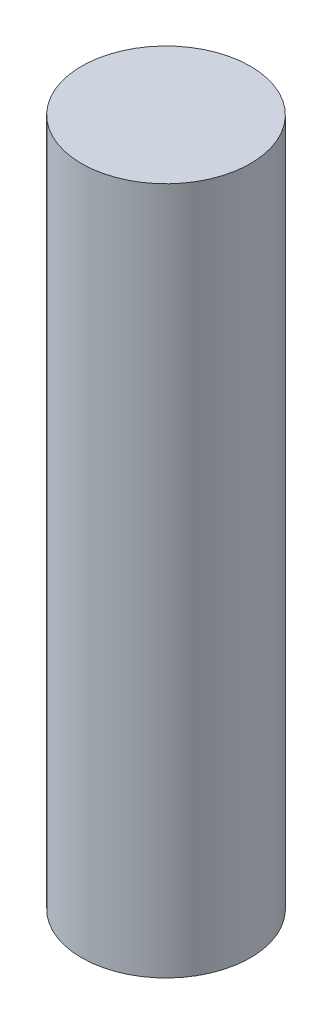
ISO-10303-21;
HEADER;
FILE_DESCRIPTION(('STEP AP214'),'2;1');
FILE_NAME('part.step','',(''),(''),'','','');
FILE_SCHEMA(('AUTOMOTIVE_DESIGN { 1 0 10303 214 1 1 1 1 }'));
ENDSEC;
DATA;
#1=APPLICATION_CONTEXT('core data for automotive mechanical design processes');
#2=APPLICATION_PROTOCOL_DEFINITION('international standard','automotive_design',2000,#1);
#3=PRODUCT_CONTEXT('',#1,'mechanical');
#4=PRODUCT('Part','Part','',(#3));
#5=PRODUCT_RELATED_PRODUCT_CATEGORY('part','',(#4));
#6=PRODUCT_DEFINITION_FORMATION('','',#4);
#7=PRODUCT_DEFINITION_CONTEXT('part definition',#1,'design');
#8=PRODUCT_DEFINITION('design','',#6,#7);
#9=PRODUCT_DEFINITION_SHAPE('','',#8);
#10=(LENGTH_UNIT() NAMED_UNIT(*) SI_UNIT(.MILLI.,.METRE.));
#11=(NAMED_UNIT(*) PLANE_ANGLE_UNIT() SI_UNIT($,.RADIAN.));
#12=(NAMED_UNIT(*) SI_UNIT($,.STERADIAN.) SOLID_ANGLE_UNIT());
#13=UNCERTAINTY_MEASURE_WITH_UNIT(LENGTH_MEASURE(1.E-05),#10,'distance_accuracy_value','');
#14=(GEOMETRIC_REPRESENTATION_CONTEXT(3) GLOBAL_UNCERTAINTY_ASSIGNED_CONTEXT((#13)) GLOBAL_UNIT_ASSIGNED_CONTEXT((#10,
#11,#12)) REPRESENTATION_CONTEXT('',''));
#15=CARTESIAN_POINT('',(0.,0.,0.));
#16=DIRECTION('',(0.,0.,1.));
#17=DIRECTION('',(1.,0.,0.));
#18=AXIS2_PLACEMENT_3D('',#15,#16,#17);
#19=CARTESIAN_POINT('',(0.,55.,0.));
#20=DIRECTION('',(0.,-1.,0.));
#21=DIRECTION('',(0.,0.,-1.));
#22=AXIS2_PLACEMENT_3D('',#19,#20,#21);
#23=CYLINDRICAL_SURFACE('',#22,13.5);
#24=CARTESIAN_POINT('',(0.,55.,0.));
#25=DIRECTION('',(0.,1.,0.));
#26=DIRECTION('',(0.,0.,1.));
#27=AXIS2_PLACEMENT_3D('',#24,#25,#26);
#28=CIRCLE('',#27,13.5);
#29=CARTESIAN_POINT('',(0.,55.,13.5));
#30=VERTEX_POINT('',#29);
#31=EDGE_CURVE('E10',#30,#30,#28,.T.);
#32=ORIENTED_EDGE('',*,*,#31,.F.);
#33=EDGE_LOOP('',(#32));
#34=FACE_BOUND('',#33,.T.);
#35=CARTESIAN_POINT('',(0.,-55.,0.));
#36=DIRECTION('',(0.,1.,0.));
#37=DIRECTION('',(0.,0.,1.));
#38=AXIS2_PLACEMENT_3D('',#35,#36,#37);
#39=CIRCLE('',#38,13.5);
#40=CARTESIAN_POINT('',(0.,-55.,13.5));
#41=VERTEX_POINT('',#40);
#42=EDGE_CURVE('E48',#41,#41,#39,.T.);
#43=ORIENTED_EDGE('',*,*,#42,.T.);
#44=EDGE_LOOP('',(#43));
#45=FACE_BOUND('',#44,.T.);
#46=ADVANCED_FACE('F45',(#34,#45),#23,.T.);
#47=CARTESIAN_POINT('',(0.,55.,0.));
#48=DIRECTION('',(0.,1.,0.));
#49=DIRECTION('',(0.,0.,1.));
#50=AXIS2_PLACEMENT_3D('',#47,#48,#49);
#51=PLANE('',#50);
#52=ORIENTED_EDGE('',*,*,#31,.T.);
#53=EDGE_LOOP('',(#52));
#54=FACE_BOUND('',#53,.T.);
#55=ADVANCED_FACE('F62',(#54),#51,.T.);
#56=CARTESIAN_POINT('',(0.,-55.,0.));
#57=DIRECTION('',(0.,1.,0.));
#58=DIRECTION('',(0.,0.,1.));
#59=AXIS2_PLACEMENT_3D('',#56,#57,#58);
#60=PLANE('',#59);
#61=ORIENTED_EDGE('',*,*,#42,.F.);
#62=EDGE_LOOP('',(#61));
#63=FACE_BOUND('',#62,.T.);
#64=ADVANCED_FACE('F60',(#63),#60,.F.);
#65=CLOSED_SHELL('',(#46,#55,#64));
#66=MANIFOLD_SOLID_BREP('B2',#65);
#67=ADVANCED_BREP_SHAPE_REPRESENTATION('',(#18,#66),#14);
#68=SHAPE_DEFINITION_REPRESENTATION(#9,#67);
ENDSEC;
END-ISO-10303-21;
